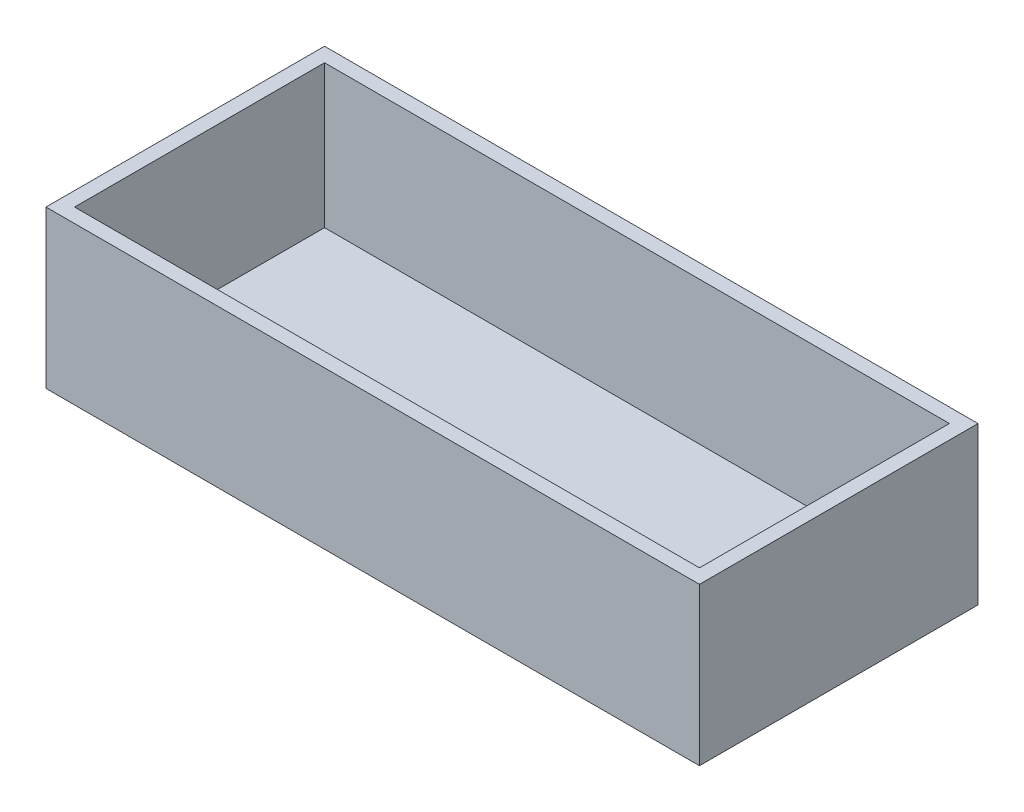
ISO-10303-21;
HEADER;
FILE_DESCRIPTION(('STEP AP214'),'2;1');
FILE_NAME('part.step','',(''),(''),'','','');
FILE_SCHEMA(('AUTOMOTIVE_DESIGN { 1 0 10303 214 1 1 1 1 }'));
ENDSEC;
DATA;
#1=APPLICATION_CONTEXT('core data for automotive mechanical design processes');
#2=APPLICATION_PROTOCOL_DEFINITION('international standard','automotive_design',2000,#1);
#3=PRODUCT_CONTEXT('',#1,'mechanical');
#4=PRODUCT('Part','Part','',(#3));
#5=PRODUCT_RELATED_PRODUCT_CATEGORY('part','',(#4));
#6=PRODUCT_DEFINITION_FORMATION('','',#4);
#7=PRODUCT_DEFINITION_CONTEXT('part definition',#1,'design');
#8=PRODUCT_DEFINITION('design','',#6,#7);
#9=PRODUCT_DEFINITION_SHAPE('','',#8);
#10=(LENGTH_UNIT() NAMED_UNIT(*) SI_UNIT(.MILLI.,.METRE.));
#11=(NAMED_UNIT(*) PLANE_ANGLE_UNIT() SI_UNIT($,.RADIAN.));
#12=(NAMED_UNIT(*) SI_UNIT($,.STERADIAN.) SOLID_ANGLE_UNIT());
#13=UNCERTAINTY_MEASURE_WITH_UNIT(LENGTH_MEASURE(1.E-05),#10,'distance_accuracy_value','');
#14=(GEOMETRIC_REPRESENTATION_CONTEXT(3) GLOBAL_UNCERTAINTY_ASSIGNED_CONTEXT((#13)) GLOBAL_UNIT_ASSIGNED_CONTEXT((#10,
#11,#12)) REPRESENTATION_CONTEXT('',''));
#15=CARTESIAN_POINT('',(0.,0.,0.));
#16=DIRECTION('',(0.,0.,1.));
#17=DIRECTION('',(1.,0.,0.));
#18=AXIS2_PLACEMENT_3D('',#15,#16,#17);
#19=CARTESIAN_POINT('',(0.,20.,0.));
#20=DIRECTION('',(0.,1.,0.));
#21=DIRECTION('',(0.,0.,1.));
#22=AXIS2_PLACEMENT_3D('',#19,#20,#21);
#23=PLANE('',#22);
#24=DIRECTION('',(0.,0.,1.));
#25=VECTOR('',#24,1.);
#26=CARTESIAN_POINT('',(-31.8886138613861,20.,-14.6340759075908));
#27=LINE('',#26,#25);
#28=CARTESIAN_POINT('',(-31.8886138613861,20.,-14.6340759075908));
#29=VERTEX_POINT('',#28);
#30=CARTESIAN_POINT('',(-31.8886138613861,20.,24.3659240924093));
#31=VERTEX_POINT('',#30);
#32=EDGE_CURVE('E105',#29,#31,#27,.T.);
#33=ORIENTED_EDGE('',*,*,#32,.T.);
#34=DIRECTION('',(1.,0.,0.));
#35=VECTOR('',#34,1.);
#36=CARTESIAN_POINT('',(-31.8886138613861,20.,24.3659240924093));
#37=LINE('',#36,#35);
#38=CARTESIAN_POINT('',(59.6113861386139,20.,24.3659240924093));
#39=VERTEX_POINT('',#38);
#40=EDGE_CURVE('E155',#31,#39,#37,.T.);
#41=ORIENTED_EDGE('',*,*,#40,.T.);
#42=DIRECTION('',(0.,0.,-1.));
#43=VECTOR('',#42,1.);
#44=CARTESIAN_POINT('',(59.6113861386139,20.,-14.6340759075908));
#45=LINE('',#44,#43);
#46=CARTESIAN_POINT('',(59.6113861386139,20.,-14.6340759075908));
#47=VERTEX_POINT('',#46);
#48=EDGE_CURVE('E157',#39,#47,#45,.T.);
#49=ORIENTED_EDGE('',*,*,#48,.T.);
#50=DIRECTION('',(-1.,0.,0.));
#51=VECTOR('',#50,1.);
#52=CARTESIAN_POINT('',(-31.8886138613861,20.,-14.6340759075908));
#53=LINE('',#52,#51);
#54=EDGE_CURVE('E58',#47,#29,#53,.T.);
#55=ORIENTED_EDGE('',*,*,#54,.T.);
#56=EDGE_LOOP('',(#33,#41,#49,#55));
#57=FACE_BOUND('',#56,.T.);
#58=DIRECTION('',(1.,0.,0.));
#59=VECTOR('',#58,1.);
#60=CARTESIAN_POINT('',(-29.8886138613861,20.,22.3659240924093));
#61=LINE('',#60,#59);
#62=CARTESIAN_POINT('',(-29.8886138613861,20.,22.3659240924093));
#63=VERTEX_POINT('',#62);
#64=CARTESIAN_POINT('',(57.6113861386139,20.,22.3659240924093));
#65=VERTEX_POINT('',#64);
#66=EDGE_CURVE('E129',#63,#65,#61,.T.);
#67=ORIENTED_EDGE('',*,*,#66,.F.);
#68=DIRECTION('',(0.,0.,1.));
#69=VECTOR('',#68,1.);
#70=CARTESIAN_POINT('',(-29.8886138613861,20.,-12.6340759075908));
#71=LINE('',#70,#69);
#72=CARTESIAN_POINT('',(-29.8886138613861,20.,-12.6340759075908));
#73=VERTEX_POINT('',#72);
#74=EDGE_CURVE('E127',#73,#63,#71,.T.);
#75=ORIENTED_EDGE('',*,*,#74,.F.);
#76=DIRECTION('',(-1.,0.,0.));
#77=VECTOR('',#76,1.);
#78=CARTESIAN_POINT('',(-29.8886138613861,20.,-12.6340759075908));
#79=LINE('',#78,#77);
#80=CARTESIAN_POINT('',(57.6113861386139,20.,-12.6340759075908));
#81=VERTEX_POINT('',#80);
#82=EDGE_CURVE('E134',#81,#73,#79,.T.);
#83=ORIENTED_EDGE('',*,*,#82,.F.);
#84=DIRECTION('',(0.,0.,-1.));
#85=VECTOR('',#84,1.);
#86=CARTESIAN_POINT('',(57.6113861386139,20.,-12.6340759075908));
#87=LINE('',#86,#85);
#88=EDGE_CURVE('E132',#65,#81,#87,.T.);
#89=ORIENTED_EDGE('',*,*,#88,.F.);
#90=EDGE_LOOP('',(#67,#75,#83,#89));
#91=FACE_BOUND('',#90,.T.);
#92=ADVANCED_FACE('F35',(#57,#91),#23,.T.);
#93=CARTESIAN_POINT('',(-31.8886138613861,20.,-14.6340759075908));
#94=DIRECTION('',(1.,0.,0.));
#95=DIRECTION('',(0.,0.,-1.));
#96=AXIS2_PLACEMENT_3D('',#93,#94,#95);
#97=PLANE('',#96);
#98=DIRECTION('',(0.,-1.,0.));
#99=VECTOR('',#98,1.);
#100=CARTESIAN_POINT('',(-31.8886138613861,20.,-14.6340759075908));
#101=LINE('',#100,#99);
#102=CARTESIAN_POINT('',(-31.8886138613861,-2.,-14.6340759075908));
#103=VERTEX_POINT('',#102);
#104=EDGE_CURVE('E100',#29,#103,#101,.T.);
#105=ORIENTED_EDGE('',*,*,#104,.T.);
#106=DIRECTION('',(0.,0.,-1.));
#107=VECTOR('',#106,1.);
#108=CARTESIAN_POINT('',(-31.8886138613861,-2.,24.3659240924093));
#109=LINE('',#108,#107);
#110=CARTESIAN_POINT('',(-31.8886138613861,-2.,24.3659240924093));
#111=VERTEX_POINT('',#110);
#112=EDGE_CURVE('E104',#111,#103,#109,.T.);
#113=ORIENTED_EDGE('',*,*,#112,.F.);
#114=DIRECTION('',(0.,-1.,0.));
#115=VECTOR('',#114,1.);
#116=CARTESIAN_POINT('',(-31.8886138613861,20.,24.3659240924093));
#117=LINE('',#116,#115);
#118=EDGE_CURVE('E11',#31,#111,#117,.T.);
#119=ORIENTED_EDGE('',*,*,#118,.F.);
#120=ORIENTED_EDGE('',*,*,#32,.F.);
#121=EDGE_LOOP('',(#105,#113,#119,#120));
#122=FACE_BOUND('',#121,.T.);
#123=ADVANCED_FACE('F37',(#122),#97,.F.);
#124=CARTESIAN_POINT('',(-31.8886138613861,20.,24.3659240924093));
#125=DIRECTION('',(0.,0.,-1.));
#126=DIRECTION('',(-1.,0.,0.));
#127=AXIS2_PLACEMENT_3D('',#124,#125,#126);
#128=PLANE('',#127);
#129=ORIENTED_EDGE('',*,*,#118,.T.);
#130=DIRECTION('',(-1.,0.,0.));
#131=VECTOR('',#130,1.);
#132=CARTESIAN_POINT('',(-31.8886138613861,-2.,24.3659240924093));
#133=LINE('',#132,#131);
#134=CARTESIAN_POINT('',(59.6113861386139,-2.,24.3659240924093));
#135=VERTEX_POINT('',#134);
#136=EDGE_CURVE('E121',#135,#111,#133,.T.);
#137=ORIENTED_EDGE('',*,*,#136,.F.);
#138=DIRECTION('',(0.,-1.,0.));
#139=VECTOR('',#138,1.);
#140=CARTESIAN_POINT('',(59.6113861386139,20.,24.3659240924093));
#141=LINE('',#140,#139);
#142=EDGE_CURVE('E43',#39,#135,#141,.T.);
#143=ORIENTED_EDGE('',*,*,#142,.F.);
#144=ORIENTED_EDGE('',*,*,#40,.F.);
#145=EDGE_LOOP('',(#129,#137,#143,#144));
#146=FACE_BOUND('',#145,.T.);
#147=ADVANCED_FACE('F165',(#146),#128,.F.);
#148=CARTESIAN_POINT('',(59.6113861386139,20.,-14.6340759075908));
#149=DIRECTION('',(-1.,0.,0.));
#150=DIRECTION('',(0.,0.,1.));
#151=AXIS2_PLACEMENT_3D('',#148,#149,#150);
#152=PLANE('',#151);
#153=ORIENTED_EDGE('',*,*,#142,.T.);
#154=DIRECTION('',(0.,0.,1.));
#155=VECTOR('',#154,1.);
#156=CARTESIAN_POINT('',(59.6113861386139,-2.,24.3659240924093));
#157=LINE('',#156,#155);
#158=CARTESIAN_POINT('',(59.6113861386139,-2.,-14.6340759075908));
#159=VERTEX_POINT('',#158);
#160=EDGE_CURVE('E116',#159,#135,#157,.T.);
#161=ORIENTED_EDGE('',*,*,#160,.F.);
#162=DIRECTION('',(0.,-1.,0.));
#163=VECTOR('',#162,1.);
#164=CARTESIAN_POINT('',(59.6113861386139,20.,-14.6340759075908));
#165=LINE('',#164,#163);
#166=EDGE_CURVE('E107',#47,#159,#165,.T.);
#167=ORIENTED_EDGE('',*,*,#166,.F.);
#168=ORIENTED_EDGE('',*,*,#48,.F.);
#169=EDGE_LOOP('',(#153,#161,#167,#168));
#170=FACE_BOUND('',#169,.T.);
#171=ADVANCED_FACE('F163',(#170),#152,.F.);
#172=CARTESIAN_POINT('',(-31.8886138613861,20.,-14.6340759075908));
#173=DIRECTION('',(0.,0.,1.));
#174=DIRECTION('',(1.,0.,0.));
#175=AXIS2_PLACEMENT_3D('',#172,#173,#174);
#176=PLANE('',#175);
#177=ORIENTED_EDGE('',*,*,#166,.T.);
#178=DIRECTION('',(1.,0.,0.));
#179=VECTOR('',#178,1.);
#180=CARTESIAN_POINT('',(-31.8886138613861,-2.,-14.6340759075908));
#181=LINE('',#180,#179);
#182=EDGE_CURVE('E110',#103,#159,#181,.T.);
#183=ORIENTED_EDGE('',*,*,#182,.F.);
#184=ORIENTED_EDGE('',*,*,#104,.F.);
#185=ORIENTED_EDGE('',*,*,#54,.F.);
#186=EDGE_LOOP('',(#177,#183,#184,#185));
#187=FACE_BOUND('',#186,.T.);
#188=ADVANCED_FACE('F111',(#187),#176,.F.);
#189=CARTESIAN_POINT('',(-29.8886138613861,20.,-12.6340759075908));
#190=DIRECTION('',(1.,0.,0.));
#191=DIRECTION('',(0.,0.,-1.));
#192=AXIS2_PLACEMENT_3D('',#189,#190,#191);
#193=PLANE('',#192);
#194=DIRECTION('',(0.,0.,1.));
#195=VECTOR('',#194,1.);
#196=CARTESIAN_POINT('',(-29.8886138613861,0.,-12.6340759075908));
#197=LINE('',#196,#195);
#198=CARTESIAN_POINT('',(-29.8886138613861,0.,-12.6340759075908));
#199=VERTEX_POINT('',#198);
#200=CARTESIAN_POINT('',(-29.8886138613861,0.,22.3659240924093));
#201=VERTEX_POINT('',#200);
#202=EDGE_CURVE('E126',#199,#201,#197,.T.);
#203=ORIENTED_EDGE('',*,*,#202,.F.);
#204=DIRECTION('',(0.,-1.,0.));
#205=VECTOR('',#204,1.);
#206=CARTESIAN_POINT('',(-29.8886138613861,20.,-12.6340759075908));
#207=LINE('',#206,#205);
#208=EDGE_CURVE('E136',#73,#199,#207,.T.);
#209=ORIENTED_EDGE('',*,*,#208,.F.);
#210=ORIENTED_EDGE('',*,*,#74,.T.);
#211=DIRECTION('',(0.,-1.,0.));
#212=VECTOR('',#211,1.);
#213=CARTESIAN_POINT('',(-29.8886138613861,20.,22.3659240924093));
#214=LINE('',#213,#212);
#215=EDGE_CURVE('E151',#63,#201,#214,.T.);
#216=ORIENTED_EDGE('',*,*,#215,.T.);
#217=EDGE_LOOP('',(#203,#209,#210,#216));
#218=FACE_BOUND('',#217,.T.);
#219=ADVANCED_FACE('F184',(#218),#193,.T.);
#220=CARTESIAN_POINT('',(-29.8886138613861,20.,22.3659240924093));
#221=DIRECTION('',(0.,0.,-1.));
#222=DIRECTION('',(-1.,0.,0.));
#223=AXIS2_PLACEMENT_3D('',#220,#221,#222);
#224=PLANE('',#223);
#225=DIRECTION('',(1.,0.,0.));
#226=VECTOR('',#225,1.);
#227=CARTESIAN_POINT('',(-29.8886138613861,0.,22.3659240924093));
#228=LINE('',#227,#226);
#229=CARTESIAN_POINT('',(57.6113861386139,0.,22.3659240924093));
#230=VERTEX_POINT('',#229);
#231=EDGE_CURVE('E139',#201,#230,#228,.T.);
#232=ORIENTED_EDGE('',*,*,#231,.F.);
#233=ORIENTED_EDGE('',*,*,#215,.F.);
#234=ORIENTED_EDGE('',*,*,#66,.T.);
#235=DIRECTION('',(0.,-1.,0.));
#236=VECTOR('',#235,1.);
#237=CARTESIAN_POINT('',(57.6113861386139,20.,22.3659240924093));
#238=LINE('',#237,#236);
#239=EDGE_CURVE('E149',#65,#230,#238,.T.);
#240=ORIENTED_EDGE('',*,*,#239,.T.);
#241=EDGE_LOOP('',(#232,#233,#234,#240));
#242=FACE_BOUND('',#241,.T.);
#243=ADVANCED_FACE('F176',(#242),#224,.T.);
#244=CARTESIAN_POINT('',(57.6113861386139,20.,-12.6340759075908));
#245=DIRECTION('',(-1.,0.,0.));
#246=DIRECTION('',(0.,0.,1.));
#247=AXIS2_PLACEMENT_3D('',#244,#245,#246);
#248=PLANE('',#247);
#249=DIRECTION('',(0.,0.,-1.));
#250=VECTOR('',#249,1.);
#251=CARTESIAN_POINT('',(57.6113861386139,0.,-12.6340759075908));
#252=LINE('',#251,#250);
#253=CARTESIAN_POINT('',(57.6113861386139,0.,-12.6340759075908));
#254=VERTEX_POINT('',#253);
#255=EDGE_CURVE('E142',#230,#254,#252,.T.);
#256=ORIENTED_EDGE('',*,*,#255,.F.);
#257=ORIENTED_EDGE('',*,*,#239,.F.);
#258=ORIENTED_EDGE('',*,*,#88,.T.);
#259=DIRECTION('',(0.,-1.,0.));
#260=VECTOR('',#259,1.);
#261=CARTESIAN_POINT('',(57.6113861386139,20.,-12.6340759075908));
#262=LINE('',#261,#260);
#263=EDGE_CURVE('E50',#81,#254,#262,.T.);
#264=ORIENTED_EDGE('',*,*,#263,.T.);
#265=EDGE_LOOP('',(#256,#257,#258,#264));
#266=FACE_BOUND('',#265,.T.);
#267=ADVANCED_FACE('F179',(#266),#248,.T.);
#268=CARTESIAN_POINT('',(-29.8886138613861,20.,-12.6340759075908));
#269=DIRECTION('',(0.,0.,1.));
#270=DIRECTION('',(1.,0.,0.));
#271=AXIS2_PLACEMENT_3D('',#268,#269,#270);
#272=PLANE('',#271);
#273=DIRECTION('',(-1.,0.,0.));
#274=VECTOR('',#273,1.);
#275=CARTESIAN_POINT('',(-29.8886138613861,0.,-12.6340759075908));
#276=LINE('',#275,#274);
#277=EDGE_CURVE('E130',#254,#199,#276,.T.);
#278=ORIENTED_EDGE('',*,*,#277,.F.);
#279=ORIENTED_EDGE('',*,*,#263,.F.);
#280=ORIENTED_EDGE('',*,*,#82,.T.);
#281=ORIENTED_EDGE('',*,*,#208,.T.);
#282=EDGE_LOOP('',(#278,#279,#280,#281));
#283=FACE_BOUND('',#282,.T.);
#284=ADVANCED_FACE('F186',(#283),#272,.T.);
#285=CARTESIAN_POINT('',(0.,0.,0.));
#286=DIRECTION('',(0.,-1.,0.));
#287=DIRECTION('',(0.,0.,-1.));
#288=AXIS2_PLACEMENT_3D('',#285,#286,#287);
#289=PLANE('',#288);
#290=ORIENTED_EDGE('',*,*,#277,.T.);
#291=ORIENTED_EDGE('',*,*,#202,.T.);
#292=ORIENTED_EDGE('',*,*,#231,.T.);
#293=ORIENTED_EDGE('',*,*,#255,.T.);
#294=EDGE_LOOP('',(#290,#291,#292,#293));
#295=FACE_BOUND('',#294,.T.);
#296=ADVANCED_FACE('F181',(#295),#289,.F.);
#297=CARTESIAN_POINT('',(0.,-2.,0.));
#298=DIRECTION('',(0.,-1.,0.));
#299=DIRECTION('',(0.,0.,-1.));
#300=AXIS2_PLACEMENT_3D('',#297,#298,#299);
#301=PLANE('',#300);
#302=ORIENTED_EDGE('',*,*,#112,.T.);
#303=ORIENTED_EDGE('',*,*,#182,.T.);
#304=ORIENTED_EDGE('',*,*,#160,.T.);
#305=ORIENTED_EDGE('',*,*,#136,.T.);
#306=EDGE_LOOP('',(#302,#303,#304,#305));
#307=FACE_BOUND('',#306,.T.);
#308=ADVANCED_FACE('F119',(#307),#301,.T.);
#309=CLOSED_SHELL('',(#92,#123,#147,#171,#188,#219,#243,#267,#284,#296,#308));
#310=MANIFOLD_SOLID_BREP('B2',#309);
#311=ADVANCED_BREP_SHAPE_REPRESENTATION('',(#18,#310),#14);
#312=SHAPE_DEFINITION_REPRESENTATION(#9,#311);
ENDSEC;
END-ISO-10303-21;
